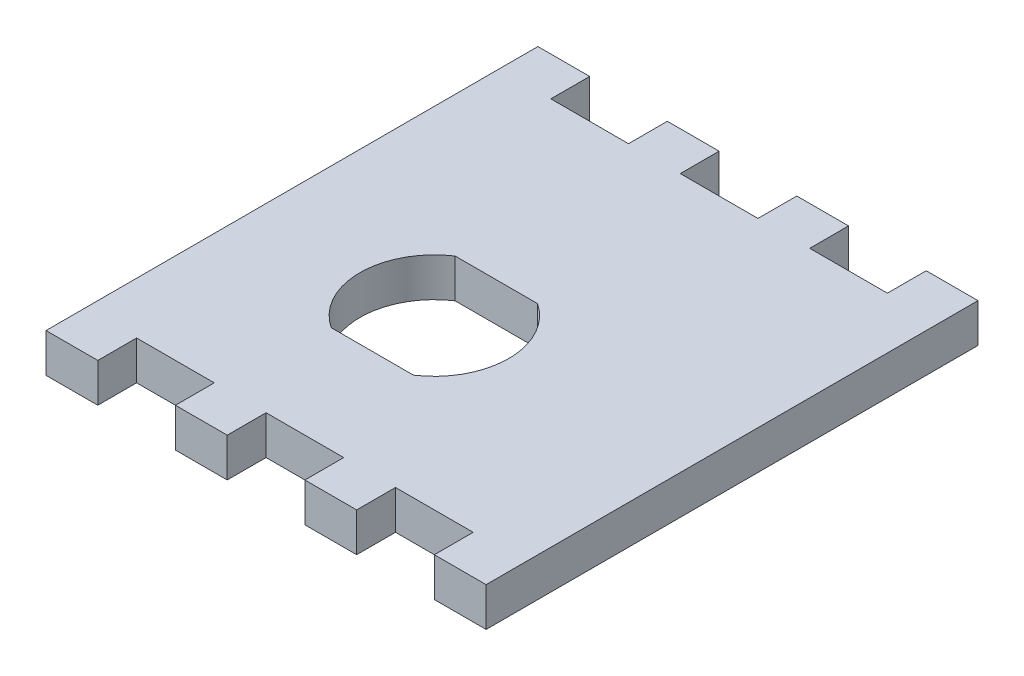
ISO-10303-21;
HEADER;
FILE_DESCRIPTION(('STEP AP214'),'2;1');
FILE_NAME('part.step','',(''),(''),'','','');
FILE_SCHEMA(('AUTOMOTIVE_DESIGN { 1 0 10303 214 1 1 1 1 }'));
ENDSEC;
DATA;
#1=APPLICATION_CONTEXT('core data for automotive mechanical design processes');
#2=APPLICATION_PROTOCOL_DEFINITION('international standard','automotive_design',2000,#1);
#3=PRODUCT_CONTEXT('',#1,'mechanical');
#4=PRODUCT('Part','Part','',(#3));
#5=PRODUCT_RELATED_PRODUCT_CATEGORY('part','',(#4));
#6=PRODUCT_DEFINITION_FORMATION('','',#4);
#7=PRODUCT_DEFINITION_CONTEXT('part definition',#1,'design');
#8=PRODUCT_DEFINITION('design','',#6,#7);
#9=PRODUCT_DEFINITION_SHAPE('','',#8);
#10=(LENGTH_UNIT() NAMED_UNIT(*) SI_UNIT(.MILLI.,.METRE.));
#11=(NAMED_UNIT(*) PLANE_ANGLE_UNIT() SI_UNIT($,.RADIAN.));
#12=(NAMED_UNIT(*) SI_UNIT($,.STERADIAN.) SOLID_ANGLE_UNIT());
#13=UNCERTAINTY_MEASURE_WITH_UNIT(LENGTH_MEASURE(1.E-05),#10,'distance_accuracy_value','');
#14=(GEOMETRIC_REPRESENTATION_CONTEXT(3) GLOBAL_UNCERTAINTY_ASSIGNED_CONTEXT((#13)) GLOBAL_UNIT_ASSIGNED_CONTEXT((#10,
#11,#12)) REPRESENTATION_CONTEXT('',''));
#15=CARTESIAN_POINT('',(0.,0.,0.));
#16=DIRECTION('',(0.,0.,1.));
#17=DIRECTION('',(1.,0.,0.));
#18=AXIS2_PLACEMENT_3D('',#15,#16,#17);
#19=CARTESIAN_POINT('',(-17.,3.,19.));
#20=DIRECTION('',(0.,0.,-1.));
#21=DIRECTION('',(-1.,0.,0.));
#22=AXIS2_PLACEMENT_3D('',#19,#20,#21);
#23=PLANE('',#22);
#24=DIRECTION('',(1.,0.,0.));
#25=VECTOR('',#24,1.);
#26=CARTESIAN_POINT('',(-17.,0.,19.));
#27=LINE('',#26,#25);
#28=CARTESIAN_POINT('',(3.,0.,19.));
#29=VERTEX_POINT('',#28);
#30=CARTESIAN_POINT('',(7.,0.,19.));
#31=VERTEX_POINT('',#30);
#32=EDGE_CURVE('E593',#29,#31,#27,.T.);
#33=ORIENTED_EDGE('',*,*,#32,.T.);
#34=DIRECTION('',(0.,1.,0.));
#35=VECTOR('',#34,1.);
#36=CARTESIAN_POINT('',(7.,0.,19.));
#37=LINE('',#36,#35);
#38=CARTESIAN_POINT('',(7.,3.,19.));
#39=VERTEX_POINT('',#38);
#40=EDGE_CURVE('E289',#31,#39,#37,.T.);
#41=ORIENTED_EDGE('',*,*,#40,.T.);
#42=DIRECTION('',(1.,0.,0.));
#43=VECTOR('',#42,1.);
#44=CARTESIAN_POINT('',(-17.,3.,19.));
#45=LINE('',#44,#43);
#46=CARTESIAN_POINT('',(3.,3.,19.));
#47=VERTEX_POINT('',#46);
#48=EDGE_CURVE('E606',#47,#39,#45,.T.);
#49=ORIENTED_EDGE('',*,*,#48,.F.);
#50=DIRECTION('',(0.,1.,0.));
#51=VECTOR('',#50,1.);
#52=CARTESIAN_POINT('',(3.,0.,19.));
#53=LINE('',#52,#51);
#54=EDGE_CURVE('E353',#29,#47,#53,.T.);
#55=ORIENTED_EDGE('',*,*,#54,.F.);
#56=EDGE_LOOP('',(#33,#41,#49,#55));
#57=FACE_BOUND('',#56,.T.);
#58=ADVANCED_FACE('F33',(#57),#23,.F.);
#59=CARTESIAN_POINT('',(-17.,3.,-19.));
#60=DIRECTION('',(0.,0.,1.));
#61=DIRECTION('',(1.,0.,0.));
#62=AXIS2_PLACEMENT_3D('',#59,#60,#61);
#63=PLANE('',#62);
#64=DIRECTION('',(-1.,0.,0.));
#65=VECTOR('',#64,1.);
#66=CARTESIAN_POINT('',(-17.,3.,-19.));
#67=LINE('',#66,#65);
#68=CARTESIAN_POINT('',(7.,3.,-19.));
#69=VERTEX_POINT('',#68);
#70=CARTESIAN_POINT('',(3.,3.,-19.));
#71=VERTEX_POINT('',#70);
#72=EDGE_CURVE('E446',#69,#71,#67,.T.);
#73=ORIENTED_EDGE('',*,*,#72,.F.);
#74=DIRECTION('',(0.,1.,0.));
#75=VECTOR('',#74,1.);
#76=CARTESIAN_POINT('',(7.,0.,-19.));
#77=LINE('',#76,#75);
#78=CARTESIAN_POINT('',(7.,0.,-19.));
#79=VERTEX_POINT('',#78);
#80=EDGE_CURVE('E322',#79,#69,#77,.T.);
#81=ORIENTED_EDGE('',*,*,#80,.F.);
#82=DIRECTION('',(-1.,0.,0.));
#83=VECTOR('',#82,1.);
#84=CARTESIAN_POINT('',(-17.,0.,-19.));
#85=LINE('',#84,#83);
#86=CARTESIAN_POINT('',(3.,0.,-19.));
#87=VERTEX_POINT('',#86);
#88=EDGE_CURVE('E461',#79,#87,#85,.T.);
#89=ORIENTED_EDGE('',*,*,#88,.T.);
#90=DIRECTION('',(0.,1.,0.));
#91=VECTOR('',#90,1.);
#92=CARTESIAN_POINT('',(3.,0.,-19.));
#93=LINE('',#92,#91);
#94=EDGE_CURVE('E378',#87,#71,#93,.T.);
#95=ORIENTED_EDGE('',*,*,#94,.T.);
#96=EDGE_LOOP('',(#73,#81,#89,#95));
#97=FACE_BOUND('',#96,.T.);
#98=ADVANCED_FACE('F509',(#97),#63,.F.);
#99=CARTESIAN_POINT('',(-7.,0.,19.));
#100=VERTEX_POINT('',#99);
#101=CARTESIAN_POINT('',(-3.,0.,19.));
#102=VERTEX_POINT('',#101);
#103=EDGE_CURVE('E466',#100,#102,#27,.T.);
#104=ORIENTED_EDGE('',*,*,#103,.T.);
#105=DIRECTION('',(0.,1.,0.));
#106=VECTOR('',#105,1.);
#107=CARTESIAN_POINT('',(-3.,0.,19.));
#108=LINE('',#107,#106);
#109=CARTESIAN_POINT('',(-3.,3.,19.));
#110=VERTEX_POINT('',#109);
#111=EDGE_CURVE('E341',#102,#110,#108,.T.);
#112=ORIENTED_EDGE('',*,*,#111,.T.);
#113=CARTESIAN_POINT('',(-7.,3.,19.));
#114=VERTEX_POINT('',#113);
#115=EDGE_CURVE('E453',#114,#110,#45,.T.);
#116=ORIENTED_EDGE('',*,*,#115,.F.);
#117=DIRECTION('',(0.,1.,0.));
#118=VECTOR('',#117,1.);
#119=CARTESIAN_POINT('',(-7.,0.,19.));
#120=LINE('',#119,#118);
#121=EDGE_CURVE('E406',#100,#114,#120,.T.);
#122=ORIENTED_EDGE('',*,*,#121,.F.);
#123=EDGE_LOOP('',(#104,#112,#116,#122));
#124=FACE_BOUND('',#123,.T.);
#125=ADVANCED_FACE('F546',(#124),#23,.F.);
#126=CARTESIAN_POINT('',(-3.,3.,-19.));
#127=VERTEX_POINT('',#126);
#128=CARTESIAN_POINT('',(-7.,3.,-19.));
#129=VERTEX_POINT('',#128);
#130=EDGE_CURVE('E494',#127,#129,#67,.T.);
#131=ORIENTED_EDGE('',*,*,#130,.F.);
#132=DIRECTION('',(0.,1.,0.));
#133=VECTOR('',#132,1.);
#134=CARTESIAN_POINT('',(-3.,0.,-19.));
#135=LINE('',#134,#133);
#136=CARTESIAN_POINT('',(-3.,0.,-19.));
#137=VERTEX_POINT('',#136);
#138=EDGE_CURVE('E375',#137,#127,#135,.T.);
#139=ORIENTED_EDGE('',*,*,#138,.F.);
#140=CARTESIAN_POINT('',(-7.,0.,-19.));
#141=VERTEX_POINT('',#140);
#142=EDGE_CURVE('E511',#137,#141,#85,.T.);
#143=ORIENTED_EDGE('',*,*,#142,.T.);
#144=DIRECTION('',(0.,1.,0.));
#145=VECTOR('',#144,1.);
#146=CARTESIAN_POINT('',(-7.,0.,-19.));
#147=LINE('',#146,#145);
#148=EDGE_CURVE('E431',#141,#129,#147,.T.);
#149=ORIENTED_EDGE('',*,*,#148,.T.);
#150=EDGE_LOOP('',(#131,#139,#143,#149));
#151=FACE_BOUND('',#150,.T.);
#152=ADVANCED_FACE('F525',(#151),#63,.F.);
#153=CARTESIAN_POINT('',(-17.,0.,19.));
#154=VERTEX_POINT('',#153);
#155=CARTESIAN_POINT('',(-13.,0.,19.));
#156=VERTEX_POINT('',#155);
#157=EDGE_CURVE('E441',#154,#156,#27,.T.);
#158=ORIENTED_EDGE('',*,*,#157,.T.);
#159=DIRECTION('',(0.,1.,0.));
#160=VECTOR('',#159,1.);
#161=CARTESIAN_POINT('',(-13.,0.,19.));
#162=LINE('',#161,#160);
#163=CARTESIAN_POINT('',(-13.,3.,19.));
#164=VERTEX_POINT('',#163);
#165=EDGE_CURVE('E394',#156,#164,#162,.T.);
#166=ORIENTED_EDGE('',*,*,#165,.T.);
#167=CARTESIAN_POINT('',(-17.,3.,19.));
#168=VERTEX_POINT('',#167);
#169=EDGE_CURVE('E449',#168,#164,#45,.T.);
#170=ORIENTED_EDGE('',*,*,#169,.F.);
#171=DIRECTION('',(0.,-1.,0.));
#172=VECTOR('',#171,1.);
#173=CARTESIAN_POINT('',(-17.,3.,19.));
#174=LINE('',#173,#172);
#175=EDGE_CURVE('E469',#168,#154,#174,.T.);
#176=ORIENTED_EDGE('',*,*,#175,.T.);
#177=EDGE_LOOP('',(#158,#166,#170,#176));
#178=FACE_BOUND('',#177,.T.);
#179=ADVANCED_FACE('F484',(#178),#23,.F.);
#180=CARTESIAN_POINT('',(-13.,3.,-19.));
#181=VERTEX_POINT('',#180);
#182=CARTESIAN_POINT('',(-17.,3.,-19.));
#183=VERTEX_POINT('',#182);
#184=EDGE_CURVE('E440',#181,#183,#67,.T.);
#185=ORIENTED_EDGE('',*,*,#184,.F.);
#186=DIRECTION('',(0.,1.,0.));
#187=VECTOR('',#186,1.);
#188=CARTESIAN_POINT('',(-13.,0.,-19.));
#189=LINE('',#188,#187);
#190=CARTESIAN_POINT('',(-13.,0.,-19.));
#191=VERTEX_POINT('',#190);
#192=EDGE_CURVE('E428',#191,#181,#189,.T.);
#193=ORIENTED_EDGE('',*,*,#192,.F.);
#194=CARTESIAN_POINT('',(-17.,0.,-19.));
#195=VERTEX_POINT('',#194);
#196=EDGE_CURVE('E456',#191,#195,#85,.T.);
#197=ORIENTED_EDGE('',*,*,#196,.T.);
#198=DIRECTION('',(0.,-1.,0.));
#199=VECTOR('',#198,1.);
#200=CARTESIAN_POINT('',(-17.,3.,-19.));
#201=LINE('',#200,#199);
#202=EDGE_CURVE('E41',#183,#195,#201,.T.);
#203=ORIENTED_EDGE('',*,*,#202,.F.);
#204=EDGE_LOOP('',(#185,#193,#197,#203));
#205=FACE_BOUND('',#204,.T.);
#206=ADVANCED_FACE('F516',(#205),#63,.F.);
#207=CARTESIAN_POINT('',(17.,3.,19.));
#208=DIRECTION('',(-1.,0.,0.));
#209=DIRECTION('',(0.,0.,1.));
#210=AXIS2_PLACEMENT_3D('',#207,#208,#209);
#211=PLANE('',#210);
#212=DIRECTION('',(0.,0.,-1.));
#213=VECTOR('',#212,1.);
#214=CARTESIAN_POINT('',(17.,0.,19.));
#215=LINE('',#214,#213);
#216=CARTESIAN_POINT('',(17.,0.,19.));
#217=VERTEX_POINT('',#216);
#218=CARTESIAN_POINT('',(17.,0.,-19.));
#219=VERTEX_POINT('',#218);
#220=EDGE_CURVE('E430',#217,#219,#215,.T.);
#221=ORIENTED_EDGE('',*,*,#220,.T.);
#222=DIRECTION('',(0.,-1.,0.));
#223=VECTOR('',#222,1.);
#224=CARTESIAN_POINT('',(17.,3.,-19.));
#225=LINE('',#224,#223);
#226=CARTESIAN_POINT('',(17.,3.,-19.));
#227=VERTEX_POINT('',#226);
#228=EDGE_CURVE('E11',#227,#219,#225,.T.);
#229=ORIENTED_EDGE('',*,*,#228,.F.);
#230=DIRECTION('',(0.,0.,-1.));
#231=VECTOR('',#230,1.);
#232=CARTESIAN_POINT('',(17.,3.,19.));
#233=LINE('',#232,#231);
#234=CARTESIAN_POINT('',(17.,3.,19.));
#235=VERTEX_POINT('',#234);
#236=EDGE_CURVE('E437',#235,#227,#233,.T.);
#237=ORIENTED_EDGE('',*,*,#236,.F.);
#238=DIRECTION('',(0.,-1.,0.));
#239=VECTOR('',#238,1.);
#240=CARTESIAN_POINT('',(17.,3.,19.));
#241=LINE('',#240,#239);
#242=EDGE_CURVE('E452',#235,#217,#241,.T.);
#243=ORIENTED_EDGE('',*,*,#242,.T.);
#244=EDGE_LOOP('',(#221,#229,#237,#243));
#245=FACE_BOUND('',#244,.T.);
#246=ADVANCED_FACE('F35',(#245),#211,.F.);
#247=CARTESIAN_POINT('',(13.,0.,-19.));
#248=VERTEX_POINT('',#247);
#249=EDGE_CURVE('E457',#219,#248,#85,.T.);
#250=ORIENTED_EDGE('',*,*,#249,.T.);
#251=DIRECTION('',(0.,1.,0.));
#252=VECTOR('',#251,1.);
#253=CARTESIAN_POINT('',(13.,0.,-19.));
#254=LINE('',#253,#252);
#255=CARTESIAN_POINT('',(13.,3.,-19.));
#256=VERTEX_POINT('',#255);
#257=EDGE_CURVE('E325',#248,#256,#254,.T.);
#258=ORIENTED_EDGE('',*,*,#257,.T.);
#259=EDGE_CURVE('E442',#227,#256,#67,.T.);
#260=ORIENTED_EDGE('',*,*,#259,.F.);
#261=ORIENTED_EDGE('',*,*,#228,.T.);
#262=EDGE_LOOP('',(#250,#258,#260,#261));
#263=FACE_BOUND('',#262,.T.);
#264=ADVANCED_FACE('F551',(#263),#63,.F.);
#265=CARTESIAN_POINT('',(-17.,3.,19.));
#266=DIRECTION('',(1.,0.,0.));
#267=DIRECTION('',(0.,0.,-1.));
#268=AXIS2_PLACEMENT_3D('',#265,#266,#267);
#269=PLANE('',#268);
#270=DIRECTION('',(0.,0.,1.));
#271=VECTOR('',#270,1.);
#272=CARTESIAN_POINT('',(-17.,0.,19.));
#273=LINE('',#272,#271);
#274=EDGE_CURVE('E460',#195,#154,#273,.T.);
#275=ORIENTED_EDGE('',*,*,#274,.T.);
#276=ORIENTED_EDGE('',*,*,#175,.F.);
#277=DIRECTION('',(0.,0.,1.));
#278=VECTOR('',#277,1.);
#279=CARTESIAN_POINT('',(-17.,3.,19.));
#280=LINE('',#279,#278);
#281=EDGE_CURVE('E445',#183,#168,#280,.T.);
#282=ORIENTED_EDGE('',*,*,#281,.F.);
#283=ORIENTED_EDGE('',*,*,#202,.T.);
#284=EDGE_LOOP('',(#275,#276,#282,#283));
#285=FACE_BOUND('',#284,.T.);
#286=ADVANCED_FACE('F476',(#285),#269,.F.);
#287=CARTESIAN_POINT('',(13.,3.,19.));
#288=VERTEX_POINT('',#287);
#289=EDGE_CURVE('E448',#288,#235,#45,.T.);
#290=ORIENTED_EDGE('',*,*,#289,.F.);
#291=DIRECTION('',(0.,1.,0.));
#292=VECTOR('',#291,1.);
#293=CARTESIAN_POINT('',(13.,0.,19.));
#294=LINE('',#293,#292);
#295=CARTESIAN_POINT('',(13.,0.,19.));
#296=VERTEX_POINT('',#295);
#297=EDGE_CURVE('E301',#296,#288,#294,.T.);
#298=ORIENTED_EDGE('',*,*,#297,.F.);
#299=EDGE_CURVE('E463',#296,#217,#27,.T.);
#300=ORIENTED_EDGE('',*,*,#299,.T.);
#301=ORIENTED_EDGE('',*,*,#242,.F.);
#302=EDGE_LOOP('',(#290,#298,#300,#301));
#303=FACE_BOUND('',#302,.T.);
#304=ADVANCED_FACE('F547',(#303),#23,.F.);
#305=CARTESIAN_POINT('',(0.,3.,0.));
#306=DIRECTION('',(0.,-1.,0.));
#307=DIRECTION('',(0.,0.,-1.));
#308=AXIS2_PLACEMENT_3D('',#305,#306,#307);
#309=PLANE('',#308);
#310=DIRECTION('',(-1.,0.,0.));
#311=VECTOR('',#310,1.);
#312=CARTESIAN_POINT('',(-6.18332409593905,3.,-1.78841807909604));
#313=LINE('',#312,#311);
#314=CARTESIAN_POINT('',(0.18332409593905,3.,-1.78841807909604));
#315=VERTEX_POINT('',#314);
#316=CARTESIAN_POINT('',(-6.18332409593905,3.,-1.78841807909604));
#317=VERTEX_POINT('',#316);
#318=EDGE_CURVE('E269',#315,#317,#313,.T.);
#319=ORIENTED_EDGE('',*,*,#318,.F.);
#320=CARTESIAN_POINT('',(-3.,3.,3.));
#321=DIRECTION('',(0.,1.,0.));
#322=DIRECTION('',(0.,0.,1.));
#323=AXIS2_PLACEMENT_3D('',#320,#321,#322);
#324=CIRCLE('',#323,5.75);
#325=CARTESIAN_POINT('',(0.178432090757255,3.,7.79166666666667));
#326=VERTEX_POINT('',#325);
#327=EDGE_CURVE('E48',#326,#315,#324,.T.);
#328=ORIENTED_EDGE('',*,*,#327,.F.);
#329=DIRECTION('',(1.,0.,0.));
#330=VECTOR('',#329,1.);
#331=CARTESIAN_POINT('',(-6.17843209075726,3.,7.79166666666667));
#332=LINE('',#331,#330);
#333=CARTESIAN_POINT('',(-6.17843209075726,3.,7.79166666666667));
#334=VERTEX_POINT('',#333);
#335=EDGE_CURVE('E260',#334,#326,#332,.T.);
#336=ORIENTED_EDGE('',*,*,#335,.F.);
#337=CARTESIAN_POINT('',(-3.,3.,3.));
#338=DIRECTION('',(0.,1.,0.));
#339=DIRECTION('',(0.,0.,1.));
#340=AXIS2_PLACEMENT_3D('',#337,#338,#339);
#341=CIRCLE('',#340,5.75);
#342=EDGE_CURVE('E263',#317,#334,#341,.T.);
#343=ORIENTED_EDGE('',*,*,#342,.F.);
#344=EDGE_LOOP('',(#319,#328,#336,#343));
#345=FACE_BOUND('',#344,.T.);
#346=ORIENTED_EDGE('',*,*,#48,.T.);
#347=DIRECTION('',(0.,0.,1.));
#348=VECTOR('',#347,1.);
#349=CARTESIAN_POINT('',(7.,3.,16.));
#350=LINE('',#349,#348);
#351=CARTESIAN_POINT('',(7.,3.,16.));
#352=VERTEX_POINT('',#351);
#353=EDGE_CURVE('E275',#352,#39,#350,.T.);
#354=ORIENTED_EDGE('',*,*,#353,.F.);
#355=DIRECTION('',(-1.,0.,0.));
#356=VECTOR('',#355,1.);
#357=CARTESIAN_POINT('',(7.,3.,16.));
#358=LINE('',#357,#356);
#359=CARTESIAN_POINT('',(13.,3.,16.));
#360=VERTEX_POINT('',#359);
#361=EDGE_CURVE('E283',#360,#352,#358,.T.);
#362=ORIENTED_EDGE('',*,*,#361,.F.);
#363=DIRECTION('',(0.,0.,-1.));
#364=VECTOR('',#363,1.);
#365=CARTESIAN_POINT('',(13.,3.,16.));
#366=LINE('',#365,#364);
#367=EDGE_CURVE('E291',#288,#360,#366,.T.);
#368=ORIENTED_EDGE('',*,*,#367,.F.);
#369=ORIENTED_EDGE('',*,*,#289,.T.);
#370=ORIENTED_EDGE('',*,*,#236,.T.);
#371=ORIENTED_EDGE('',*,*,#259,.T.);
#372=DIRECTION('',(0.,0.,-1.));
#373=VECTOR('',#372,1.);
#374=CARTESIAN_POINT('',(13.,3.,-19.));
#375=LINE('',#374,#373);
#376=CARTESIAN_POINT('',(13.,3.,-16.));
#377=VERTEX_POINT('',#376);
#378=EDGE_CURVE('E309',#377,#256,#375,.T.);
#379=ORIENTED_EDGE('',*,*,#378,.F.);
#380=DIRECTION('',(1.,0.,0.));
#381=VECTOR('',#380,1.);
#382=CARTESIAN_POINT('',(7.,3.,-16.));
#383=LINE('',#382,#381);
#384=CARTESIAN_POINT('',(7.,3.,-16.));
#385=VERTEX_POINT('',#384);
#386=EDGE_CURVE('E318',#385,#377,#383,.T.);
#387=ORIENTED_EDGE('',*,*,#386,.F.);
#388=DIRECTION('',(0.,0.,1.));
#389=VECTOR('',#388,1.);
#390=CARTESIAN_POINT('',(7.,3.,-19.));
#391=LINE('',#390,#389);
#392=EDGE_CURVE('E298',#69,#385,#391,.T.);
#393=ORIENTED_EDGE('',*,*,#392,.F.);
#394=ORIENTED_EDGE('',*,*,#72,.T.);
#395=DIRECTION('',(0.,0.,-1.));
#396=VECTOR('',#395,1.);
#397=CARTESIAN_POINT('',(3.,3.,-19.));
#398=LINE('',#397,#396);
#399=CARTESIAN_POINT('',(3.,3.,-16.));
#400=VERTEX_POINT('',#399);
#401=EDGE_CURVE('E361',#400,#71,#398,.T.);
#402=ORIENTED_EDGE('',*,*,#401,.F.);
#403=DIRECTION('',(1.,0.,0.));
#404=VECTOR('',#403,1.);
#405=CARTESIAN_POINT('',(-3.,3.,-16.));
#406=LINE('',#405,#404);
#407=CARTESIAN_POINT('',(-3.,3.,-16.));
#408=VERTEX_POINT('',#407);
#409=EDGE_CURVE('E370',#408,#400,#406,.T.);
#410=ORIENTED_EDGE('',*,*,#409,.F.);
#411=DIRECTION('',(0.,0.,1.));
#412=VECTOR('',#411,1.);
#413=CARTESIAN_POINT('',(-3.,3.,-19.));
#414=LINE('',#413,#412);
#415=EDGE_CURVE('E350',#127,#408,#414,.T.);
#416=ORIENTED_EDGE('',*,*,#415,.F.);
#417=ORIENTED_EDGE('',*,*,#130,.T.);
#418=DIRECTION('',(0.,0.,-1.));
#419=VECTOR('',#418,1.);
#420=CARTESIAN_POINT('',(-7.,3.,-19.));
#421=LINE('',#420,#419);
#422=CARTESIAN_POINT('',(-7.,3.,-16.));
#423=VERTEX_POINT('',#422);
#424=EDGE_CURVE('E414',#423,#129,#421,.T.);
#425=ORIENTED_EDGE('',*,*,#424,.F.);
#426=DIRECTION('',(1.,0.,0.));
#427=VECTOR('',#426,1.);
#428=CARTESIAN_POINT('',(-13.,3.,-16.));
#429=LINE('',#428,#427);
#430=CARTESIAN_POINT('',(-13.,3.,-16.));
#431=VERTEX_POINT('',#430);
#432=EDGE_CURVE('E423',#431,#423,#429,.T.);
#433=ORIENTED_EDGE('',*,*,#432,.F.);
#434=DIRECTION('',(0.,0.,1.));
#435=VECTOR('',#434,1.);
#436=CARTESIAN_POINT('',(-13.,3.,-19.));
#437=LINE('',#436,#435);
#438=EDGE_CURVE('E403',#181,#431,#437,.T.);
#439=ORIENTED_EDGE('',*,*,#438,.F.);
#440=ORIENTED_EDGE('',*,*,#184,.T.);
#441=ORIENTED_EDGE('',*,*,#281,.T.);
#442=ORIENTED_EDGE('',*,*,#169,.T.);
#443=DIRECTION('',(0.,0.,1.));
#444=VECTOR('',#443,1.);
#445=CARTESIAN_POINT('',(-13.,3.,16.));
#446=LINE('',#445,#444);
#447=CARTESIAN_POINT('',(-13.,3.,16.));
#448=VERTEX_POINT('',#447);
#449=EDGE_CURVE('E377',#448,#164,#446,.T.);
#450=ORIENTED_EDGE('',*,*,#449,.F.);
#451=DIRECTION('',(-1.,0.,0.));
#452=VECTOR('',#451,1.);
#453=CARTESIAN_POINT('',(-13.,3.,16.));
#454=LINE('',#453,#452);
#455=CARTESIAN_POINT('',(-7.,3.,16.));
#456=VERTEX_POINT('',#455);
#457=EDGE_CURVE('E388',#456,#448,#454,.T.);
#458=ORIENTED_EDGE('',*,*,#457,.F.);
#459=DIRECTION('',(0.,0.,-1.));
#460=VECTOR('',#459,1.);
#461=CARTESIAN_POINT('',(-7.,3.,16.));
#462=LINE('',#461,#460);
#463=EDGE_CURVE('E396',#114,#456,#462,.T.);
#464=ORIENTED_EDGE('',*,*,#463,.F.);
#465=ORIENTED_EDGE('',*,*,#115,.T.);
#466=DIRECTION('',(0.,0.,1.));
#467=VECTOR('',#466,1.);
#468=CARTESIAN_POINT('',(-3.,3.,16.));
#469=LINE('',#468,#467);
#470=CARTESIAN_POINT('',(-3.,3.,16.));
#471=VERTEX_POINT('',#470);
#472=EDGE_CURVE('E324',#471,#110,#469,.T.);
#473=ORIENTED_EDGE('',*,*,#472,.F.);
#474=DIRECTION('',(-1.,0.,0.));
#475=VECTOR('',#474,1.);
#476=CARTESIAN_POINT('',(-3.,3.,16.));
#477=LINE('',#476,#475);
#478=CARTESIAN_POINT('',(3.,3.,16.));
#479=VERTEX_POINT('',#478);
#480=EDGE_CURVE('E335',#479,#471,#477,.T.);
#481=ORIENTED_EDGE('',*,*,#480,.F.);
#482=DIRECTION('',(0.,0.,-1.));
#483=VECTOR('',#482,1.);
#484=CARTESIAN_POINT('',(3.,3.,16.));
#485=LINE('',#484,#483);
#486=EDGE_CURVE('E343',#47,#479,#485,.T.);
#487=ORIENTED_EDGE('',*,*,#486,.F.);
#488=EDGE_LOOP('',(#346,#354,#362,#368,#369,#370,#371,#379,#387,#393,#394,#402,#410,#416,#417,
#425,#433,#439,#440,#441,#442,#450,#458,#464,#465,#473,#481,#487));
#489=FACE_BOUND('',#488,.T.);
#490=ADVANCED_FACE('F489',(#345,#489),#309,.F.);
#491=CARTESIAN_POINT('',(0.,0.,0.));
#492=DIRECTION('',(0.,-1.,0.));
#493=DIRECTION('',(0.,0.,-1.));
#494=AXIS2_PLACEMENT_3D('',#491,#492,#493);
#495=PLANE('',#494);
#496=CARTESIAN_POINT('',(-3.,0.,3.));
#497=DIRECTION('',(0.,1.,0.));
#498=DIRECTION('',(0.,0.,1.));
#499=AXIS2_PLACEMENT_3D('',#496,#497,#498);
#500=CIRCLE('',#499,5.75);
#501=CARTESIAN_POINT('',(0.178432090757255,0.,7.79166666666667));
#502=VERTEX_POINT('',#501);
#503=CARTESIAN_POINT('',(0.18332409593905,0.,-1.78841807909604));
#504=VERTEX_POINT('',#503);
#505=EDGE_CURVE('E244',#502,#504,#500,.T.);
#506=ORIENTED_EDGE('',*,*,#505,.T.);
#507=DIRECTION('',(-1.,0.,0.));
#508=VECTOR('',#507,1.);
#509=CARTESIAN_POINT('',(-6.18332409593905,0.,-1.78841807909604));
#510=LINE('',#509,#508);
#511=CARTESIAN_POINT('',(-6.18332409593905,0.,-1.78841807909604));
#512=VERTEX_POINT('',#511);
#513=EDGE_CURVE('E253',#504,#512,#510,.T.);
#514=ORIENTED_EDGE('',*,*,#513,.T.);
#515=CARTESIAN_POINT('',(-3.,0.,3.));
#516=DIRECTION('',(0.,1.,0.));
#517=DIRECTION('',(0.,0.,1.));
#518=AXIS2_PLACEMENT_3D('',#515,#516,#517);
#519=CIRCLE('',#518,5.75);
#520=CARTESIAN_POINT('',(-6.17843209075726,0.,7.79166666666667));
#521=VERTEX_POINT('',#520);
#522=EDGE_CURVE('E56',#512,#521,#519,.T.);
#523=ORIENTED_EDGE('',*,*,#522,.T.);
#524=DIRECTION('',(1.,0.,0.));
#525=VECTOR('',#524,1.);
#526=CARTESIAN_POINT('',(-6.17843209075726,0.,7.79166666666667));
#527=LINE('',#526,#525);
#528=EDGE_CURVE('E250',#521,#502,#527,.T.);
#529=ORIENTED_EDGE('',*,*,#528,.T.);
#530=EDGE_LOOP('',(#506,#514,#523,#529));
#531=FACE_BOUND('',#530,.T.);
#532=DIRECTION('',(0.,0.,1.));
#533=VECTOR('',#532,1.);
#534=CARTESIAN_POINT('',(7.,0.,16.));
#535=LINE('',#534,#533);
#536=CARTESIAN_POINT('',(7.,0.,16.));
#537=VERTEX_POINT('',#536);
#538=EDGE_CURVE('E279',#537,#31,#535,.T.);
#539=ORIENTED_EDGE('',*,*,#538,.T.);
#540=ORIENTED_EDGE('',*,*,#32,.F.);
#541=DIRECTION('',(0.,0.,-1.));
#542=VECTOR('',#541,1.);
#543=CARTESIAN_POINT('',(3.,0.,16.));
#544=LINE('',#543,#542);
#545=CARTESIAN_POINT('',(3.,0.,16.));
#546=VERTEX_POINT('',#545);
#547=EDGE_CURVE('E334',#29,#546,#544,.T.);
#548=ORIENTED_EDGE('',*,*,#547,.T.);
#549=DIRECTION('',(-1.,0.,0.));
#550=VECTOR('',#549,1.);
#551=CARTESIAN_POINT('',(-3.,0.,16.));
#552=LINE('',#551,#550);
#553=CARTESIAN_POINT('',(-3.,0.,16.));
#554=VERTEX_POINT('',#553);
#555=EDGE_CURVE('E338',#546,#554,#552,.T.);
#556=ORIENTED_EDGE('',*,*,#555,.T.);
#557=DIRECTION('',(0.,0.,1.));
#558=VECTOR('',#557,1.);
#559=CARTESIAN_POINT('',(-3.,0.,16.));
#560=LINE('',#559,#558);
#561=EDGE_CURVE('E331',#554,#102,#560,.T.);
#562=ORIENTED_EDGE('',*,*,#561,.T.);
#563=ORIENTED_EDGE('',*,*,#103,.F.);
#564=DIRECTION('',(0.,0.,-1.));
#565=VECTOR('',#564,1.);
#566=CARTESIAN_POINT('',(-7.,0.,16.));
#567=LINE('',#566,#565);
#568=CARTESIAN_POINT('',(-7.,0.,16.));
#569=VERTEX_POINT('',#568);
#570=EDGE_CURVE('E387',#100,#569,#567,.T.);
#571=ORIENTED_EDGE('',*,*,#570,.T.);
#572=DIRECTION('',(-1.,0.,0.));
#573=VECTOR('',#572,1.);
#574=CARTESIAN_POINT('',(-13.,0.,16.));
#575=LINE('',#574,#573);
#576=CARTESIAN_POINT('',(-13.,0.,16.));
#577=VERTEX_POINT('',#576);
#578=EDGE_CURVE('E391',#569,#577,#575,.T.);
#579=ORIENTED_EDGE('',*,*,#578,.T.);
#580=DIRECTION('',(0.,0.,1.));
#581=VECTOR('',#580,1.);
#582=CARTESIAN_POINT('',(-13.,0.,16.));
#583=LINE('',#582,#581);
#584=EDGE_CURVE('E384',#577,#156,#583,.T.);
#585=ORIENTED_EDGE('',*,*,#584,.T.);
#586=ORIENTED_EDGE('',*,*,#157,.F.);
#587=ORIENTED_EDGE('',*,*,#274,.F.);
#588=ORIENTED_EDGE('',*,*,#196,.F.);
#589=DIRECTION('',(0.,0.,1.));
#590=VECTOR('',#589,1.);
#591=CARTESIAN_POINT('',(-13.,0.,-19.));
#592=LINE('',#591,#590);
#593=CARTESIAN_POINT('',(-13.,0.,-16.));
#594=VERTEX_POINT('',#593);
#595=EDGE_CURVE('E410',#191,#594,#592,.T.);
#596=ORIENTED_EDGE('',*,*,#595,.T.);
#597=DIRECTION('',(1.,0.,0.));
#598=VECTOR('',#597,1.);
#599=CARTESIAN_POINT('',(-13.,0.,-16.));
#600=LINE('',#599,#598);
#601=CARTESIAN_POINT('',(-7.,0.,-16.));
#602=VERTEX_POINT('',#601);
#603=EDGE_CURVE('E413',#594,#602,#600,.T.);
#604=ORIENTED_EDGE('',*,*,#603,.T.);
#605=DIRECTION('',(0.,0.,-1.));
#606=VECTOR('',#605,1.);
#607=CARTESIAN_POINT('',(-7.,0.,-19.));
#608=LINE('',#607,#606);
#609=EDGE_CURVE('E417',#602,#141,#608,.T.);
#610=ORIENTED_EDGE('',*,*,#609,.T.);
#611=ORIENTED_EDGE('',*,*,#142,.F.);
#612=DIRECTION('',(0.,0.,1.));
#613=VECTOR('',#612,1.);
#614=CARTESIAN_POINT('',(-3.,0.,-19.));
#615=LINE('',#614,#613);
#616=CARTESIAN_POINT('',(-3.,0.,-16.));
#617=VERTEX_POINT('',#616);
#618=EDGE_CURVE('E357',#137,#617,#615,.T.);
#619=ORIENTED_EDGE('',*,*,#618,.T.);
#620=DIRECTION('',(1.,0.,0.));
#621=VECTOR('',#620,1.);
#622=CARTESIAN_POINT('',(-3.,0.,-16.));
#623=LINE('',#622,#621);
#624=CARTESIAN_POINT('',(3.,0.,-16.));
#625=VERTEX_POINT('',#624);
#626=EDGE_CURVE('E360',#617,#625,#623,.T.);
#627=ORIENTED_EDGE('',*,*,#626,.T.);
#628=DIRECTION('',(0.,0.,-1.));
#629=VECTOR('',#628,1.);
#630=CARTESIAN_POINT('',(3.,0.,-19.));
#631=LINE('',#630,#629);
#632=EDGE_CURVE('E364',#625,#87,#631,.T.);
#633=ORIENTED_EDGE('',*,*,#632,.T.);
#634=ORIENTED_EDGE('',*,*,#88,.F.);
#635=DIRECTION('',(0.,0.,1.));
#636=VECTOR('',#635,1.);
#637=CARTESIAN_POINT('',(7.,0.,-19.));
#638=LINE('',#637,#636);
#639=CARTESIAN_POINT('',(7.,0.,-16.));
#640=VERTEX_POINT('',#639);
#641=EDGE_CURVE('E305',#79,#640,#638,.T.);
#642=ORIENTED_EDGE('',*,*,#641,.T.);
#643=DIRECTION('',(1.,0.,0.));
#644=VECTOR('',#643,1.);
#645=CARTESIAN_POINT('',(7.,0.,-16.));
#646=LINE('',#645,#644);
#647=CARTESIAN_POINT('',(13.,0.,-16.));
#648=VERTEX_POINT('',#647);
#649=EDGE_CURVE('E308',#640,#648,#646,.T.);
#650=ORIENTED_EDGE('',*,*,#649,.T.);
#651=DIRECTION('',(0.,0.,-1.));
#652=VECTOR('',#651,1.);
#653=CARTESIAN_POINT('',(13.,0.,-19.));
#654=LINE('',#653,#652);
#655=EDGE_CURVE('E312',#648,#248,#654,.T.);
#656=ORIENTED_EDGE('',*,*,#655,.T.);
#657=ORIENTED_EDGE('',*,*,#249,.F.);
#658=ORIENTED_EDGE('',*,*,#220,.F.);
#659=ORIENTED_EDGE('',*,*,#299,.F.);
#660=DIRECTION('',(0.,0.,-1.));
#661=VECTOR('',#660,1.);
#662=CARTESIAN_POINT('',(13.,0.,16.));
#663=LINE('',#662,#661);
#664=CARTESIAN_POINT('',(13.,0.,16.));
#665=VERTEX_POINT('',#664);
#666=EDGE_CURVE('E282',#296,#665,#663,.T.);
#667=ORIENTED_EDGE('',*,*,#666,.T.);
#668=DIRECTION('',(-1.,0.,0.));
#669=VECTOR('',#668,1.);
#670=CARTESIAN_POINT('',(7.,0.,16.));
#671=LINE('',#670,#669);
#672=EDGE_CURVE('E286',#665,#537,#671,.T.);
#673=ORIENTED_EDGE('',*,*,#672,.T.);
#674=EDGE_LOOP('',(#539,#540,#548,#556,#562,#563,#571,#579,#585,#586,#587,#588,#596,#604,#610,
#611,#619,#627,#633,#634,#642,#650,#656,#657,#658,#659,#667,#673));
#675=FACE_BOUND('',#674,.T.);
#676=ADVANCED_FACE('F257',(#531,#675),#495,.T.);
#677=CARTESIAN_POINT('',(-13.,0.,-19.));
#678=DIRECTION('',(-1.,0.,0.));
#679=DIRECTION('',(0.,0.,1.));
#680=AXIS2_PLACEMENT_3D('',#677,#678,#679);
#681=PLANE('',#680);
#682=ORIENTED_EDGE('',*,*,#438,.T.);
#683=DIRECTION('',(0.,1.,0.));
#684=VECTOR('',#683,1.);
#685=CARTESIAN_POINT('',(-13.,0.,-16.));
#686=LINE('',#685,#684);
#687=EDGE_CURVE('E420',#594,#431,#686,.T.);
#688=ORIENTED_EDGE('',*,*,#687,.F.);
#689=ORIENTED_EDGE('',*,*,#595,.F.);
#690=ORIENTED_EDGE('',*,*,#192,.T.);
#691=EDGE_LOOP('',(#682,#688,#689,#690));
#692=FACE_BOUND('',#691,.T.);
#693=ADVANCED_FACE('F518',(#692),#681,.F.);
#694=CARTESIAN_POINT('',(-7.,0.,-19.));
#695=DIRECTION('',(1.,0.,0.));
#696=DIRECTION('',(0.,0.,-1.));
#697=AXIS2_PLACEMENT_3D('',#694,#695,#696);
#698=PLANE('',#697);
#699=ORIENTED_EDGE('',*,*,#424,.T.);
#700=ORIENTED_EDGE('',*,*,#148,.F.);
#701=ORIENTED_EDGE('',*,*,#609,.F.);
#702=DIRECTION('',(0.,1.,0.));
#703=VECTOR('',#702,1.);
#704=CARTESIAN_POINT('',(-7.,0.,-16.));
#705=LINE('',#704,#703);
#706=EDGE_CURVE('E434',#602,#423,#705,.T.);
#707=ORIENTED_EDGE('',*,*,#706,.T.);
#708=EDGE_LOOP('',(#699,#700,#701,#707));
#709=FACE_BOUND('',#708,.T.);
#710=ADVANCED_FACE('F524',(#709),#698,.F.);
#711=CARTESIAN_POINT('',(-13.,0.,-16.));
#712=DIRECTION('',(0.,0.,1.));
#713=DIRECTION('',(1.,0.,0.));
#714=AXIS2_PLACEMENT_3D('',#711,#712,#713);
#715=PLANE('',#714);
#716=ORIENTED_EDGE('',*,*,#432,.T.);
#717=ORIENTED_EDGE('',*,*,#706,.F.);
#718=ORIENTED_EDGE('',*,*,#603,.F.);
#719=ORIENTED_EDGE('',*,*,#687,.T.);
#720=EDGE_LOOP('',(#716,#717,#718,#719));
#721=FACE_BOUND('',#720,.T.);
#722=ADVANCED_FACE('F522',(#721),#715,.F.);
#723=CARTESIAN_POINT('',(-13.,0.,16.));
#724=DIRECTION('',(-1.,0.,0.));
#725=DIRECTION('',(0.,0.,1.));
#726=AXIS2_PLACEMENT_3D('',#723,#724,#725);
#727=PLANE('',#726);
#728=ORIENTED_EDGE('',*,*,#449,.T.);
#729=ORIENTED_EDGE('',*,*,#165,.F.);
#730=ORIENTED_EDGE('',*,*,#584,.F.);
#731=DIRECTION('',(0.,1.,0.));
#732=VECTOR('',#731,1.);
#733=CARTESIAN_POINT('',(-13.,0.,16.));
#734=LINE('',#733,#732);
#735=EDGE_CURVE('E401',#577,#448,#734,.T.);
#736=ORIENTED_EDGE('',*,*,#735,.T.);
#737=EDGE_LOOP('',(#728,#729,#730,#736));
#738=FACE_BOUND('',#737,.T.);
#739=ADVANCED_FACE('F743',(#738),#727,.F.);
#740=CARTESIAN_POINT('',(-13.,0.,16.));
#741=DIRECTION('',(0.,0.,-1.));
#742=DIRECTION('',(-1.,0.,0.));
#743=AXIS2_PLACEMENT_3D('',#740,#741,#742);
#744=PLANE('',#743);
#745=ORIENTED_EDGE('',*,*,#457,.T.);
#746=ORIENTED_EDGE('',*,*,#735,.F.);
#747=ORIENTED_EDGE('',*,*,#578,.F.);
#748=DIRECTION('',(0.,1.,0.));
#749=VECTOR('',#748,1.);
#750=CARTESIAN_POINT('',(-7.,0.,16.));
#751=LINE('',#750,#749);
#752=EDGE_CURVE('E404',#569,#456,#751,.T.);
#753=ORIENTED_EDGE('',*,*,#752,.T.);
#754=EDGE_LOOP('',(#745,#746,#747,#753));
#755=FACE_BOUND('',#754,.T.);
#756=ADVANCED_FACE('F750',(#755),#744,.F.);
#757=CARTESIAN_POINT('',(-7.,0.,16.));
#758=DIRECTION('',(1.,0.,0.));
#759=DIRECTION('',(0.,0.,-1.));
#760=AXIS2_PLACEMENT_3D('',#757,#758,#759);
#761=PLANE('',#760);
#762=ORIENTED_EDGE('',*,*,#463,.T.);
#763=ORIENTED_EDGE('',*,*,#752,.F.);
#764=ORIENTED_EDGE('',*,*,#570,.F.);
#765=ORIENTED_EDGE('',*,*,#121,.T.);
#766=EDGE_LOOP('',(#762,#763,#764,#765));
#767=FACE_BOUND('',#766,.T.);
#768=ADVANCED_FACE('F758',(#767),#761,.F.);
#769=CARTESIAN_POINT('',(-3.,0.,-19.));
#770=DIRECTION('',(-1.,0.,0.));
#771=DIRECTION('',(0.,0.,1.));
#772=AXIS2_PLACEMENT_3D('',#769,#770,#771);
#773=PLANE('',#772);
#774=ORIENTED_EDGE('',*,*,#415,.T.);
#775=DIRECTION('',(0.,1.,0.));
#776=VECTOR('',#775,1.);
#777=CARTESIAN_POINT('',(-3.,0.,-16.));
#778=LINE('',#777,#776);
#779=EDGE_CURVE('E367',#617,#408,#778,.T.);
#780=ORIENTED_EDGE('',*,*,#779,.F.);
#781=ORIENTED_EDGE('',*,*,#618,.F.);
#782=ORIENTED_EDGE('',*,*,#138,.T.);
#783=EDGE_LOOP('',(#774,#780,#781,#782));
#784=FACE_BOUND('',#783,.T.);
#785=ADVANCED_FACE('F528',(#784),#773,.F.);
#786=CARTESIAN_POINT('',(3.,0.,-19.));
#787=DIRECTION('',(1.,0.,0.));
#788=DIRECTION('',(0.,0.,-1.));
#789=AXIS2_PLACEMENT_3D('',#786,#787,#788);
#790=PLANE('',#789);
#791=ORIENTED_EDGE('',*,*,#401,.T.);
#792=ORIENTED_EDGE('',*,*,#94,.F.);
#793=ORIENTED_EDGE('',*,*,#632,.F.);
#794=DIRECTION('',(0.,1.,0.));
#795=VECTOR('',#794,1.);
#796=CARTESIAN_POINT('',(3.,0.,-16.));
#797=LINE('',#796,#795);
#798=EDGE_CURVE('E381',#625,#400,#797,.T.);
#799=ORIENTED_EDGE('',*,*,#798,.T.);
#800=EDGE_LOOP('',(#791,#792,#793,#799));
#801=FACE_BOUND('',#800,.T.);
#802=ADVANCED_FACE('F507',(#801),#790,.F.);
#803=CARTESIAN_POINT('',(-3.,0.,-16.));
#804=DIRECTION('',(0.,0.,1.));
#805=DIRECTION('',(1.,0.,0.));
#806=AXIS2_PLACEMENT_3D('',#803,#804,#805);
#807=PLANE('',#806);
#808=ORIENTED_EDGE('',*,*,#409,.T.);
#809=ORIENTED_EDGE('',*,*,#798,.F.);
#810=ORIENTED_EDGE('',*,*,#626,.F.);
#811=ORIENTED_EDGE('',*,*,#779,.T.);
#812=EDGE_LOOP('',(#808,#809,#810,#811));
#813=FACE_BOUND('',#812,.T.);
#814=ADVANCED_FACE('F530',(#813),#807,.F.);
#815=CARTESIAN_POINT('',(-3.,0.,16.));
#816=DIRECTION('',(-1.,0.,0.));
#817=DIRECTION('',(0.,0.,1.));
#818=AXIS2_PLACEMENT_3D('',#815,#816,#817);
#819=PLANE('',#818);
#820=ORIENTED_EDGE('',*,*,#472,.T.);
#821=ORIENTED_EDGE('',*,*,#111,.F.);
#822=ORIENTED_EDGE('',*,*,#561,.F.);
#823=DIRECTION('',(0.,1.,0.));
#824=VECTOR('',#823,1.);
#825=CARTESIAN_POINT('',(-3.,0.,16.));
#826=LINE('',#825,#824);
#827=EDGE_CURVE('E348',#554,#471,#826,.T.);
#828=ORIENTED_EDGE('',*,*,#827,.T.);
#829=EDGE_LOOP('',(#820,#821,#822,#828));
#830=FACE_BOUND('',#829,.T.);
#831=ADVANCED_FACE('F532',(#830),#819,.F.);
#832=CARTESIAN_POINT('',(-3.,0.,16.));
#833=DIRECTION('',(0.,0.,-1.));
#834=DIRECTION('',(-1.,0.,0.));
#835=AXIS2_PLACEMENT_3D('',#832,#833,#834);
#836=PLANE('',#835);
#837=ORIENTED_EDGE('',*,*,#480,.T.);
#838=ORIENTED_EDGE('',*,*,#827,.F.);
#839=ORIENTED_EDGE('',*,*,#555,.F.);
#840=DIRECTION('',(0.,1.,0.));
#841=VECTOR('',#840,1.);
#842=CARTESIAN_POINT('',(3.,0.,16.));
#843=LINE('',#842,#841);
#844=EDGE_CURVE('E351',#546,#479,#843,.T.);
#845=ORIENTED_EDGE('',*,*,#844,.T.);
#846=EDGE_LOOP('',(#837,#838,#839,#845));
#847=FACE_BOUND('',#846,.T.);
#848=ADVANCED_FACE('F538',(#847),#836,.F.);
#849=CARTESIAN_POINT('',(3.,0.,16.));
#850=DIRECTION('',(1.,0.,0.));
#851=DIRECTION('',(0.,0.,-1.));
#852=AXIS2_PLACEMENT_3D('',#849,#850,#851);
#853=PLANE('',#852);
#854=ORIENTED_EDGE('',*,*,#486,.T.);
#855=ORIENTED_EDGE('',*,*,#844,.F.);
#856=ORIENTED_EDGE('',*,*,#547,.F.);
#857=ORIENTED_EDGE('',*,*,#54,.T.);
#858=EDGE_LOOP('',(#854,#855,#856,#857));
#859=FACE_BOUND('',#858,.T.);
#860=ADVANCED_FACE('F637',(#859),#853,.F.);
#861=CARTESIAN_POINT('',(7.,0.,-19.));
#862=DIRECTION('',(-1.,0.,0.));
#863=DIRECTION('',(0.,0.,1.));
#864=AXIS2_PLACEMENT_3D('',#861,#862,#863);
#865=PLANE('',#864);
#866=ORIENTED_EDGE('',*,*,#392,.T.);
#867=DIRECTION('',(0.,1.,0.));
#868=VECTOR('',#867,1.);
#869=CARTESIAN_POINT('',(7.,0.,-16.));
#870=LINE('',#869,#868);
#871=EDGE_CURVE('E315',#640,#385,#870,.T.);
#872=ORIENTED_EDGE('',*,*,#871,.F.);
#873=ORIENTED_EDGE('',*,*,#641,.F.);
#874=ORIENTED_EDGE('',*,*,#80,.T.);
#875=EDGE_LOOP('',(#866,#872,#873,#874));
#876=FACE_BOUND('',#875,.T.);
#877=ADVANCED_FACE('F632',(#876),#865,.F.);
#878=CARTESIAN_POINT('',(13.,0.,-19.));
#879=DIRECTION('',(1.,0.,0.));
#880=DIRECTION('',(0.,0.,-1.));
#881=AXIS2_PLACEMENT_3D('',#878,#879,#880);
#882=PLANE('',#881);
#883=ORIENTED_EDGE('',*,*,#378,.T.);
#884=ORIENTED_EDGE('',*,*,#257,.F.);
#885=ORIENTED_EDGE('',*,*,#655,.F.);
#886=DIRECTION('',(0.,1.,0.));
#887=VECTOR('',#886,1.);
#888=CARTESIAN_POINT('',(13.,0.,-16.));
#889=LINE('',#888,#887);
#890=EDGE_CURVE('E328',#648,#377,#889,.T.);
#891=ORIENTED_EDGE('',*,*,#890,.T.);
#892=EDGE_LOOP('',(#883,#884,#885,#891));
#893=FACE_BOUND('',#892,.T.);
#894=ADVANCED_FACE('F585',(#893),#882,.F.);
#895=CARTESIAN_POINT('',(7.,0.,-16.));
#896=DIRECTION('',(0.,0.,1.));
#897=DIRECTION('',(1.,0.,0.));
#898=AXIS2_PLACEMENT_3D('',#895,#896,#897);
#899=PLANE('',#898);
#900=ORIENTED_EDGE('',*,*,#386,.T.);
#901=ORIENTED_EDGE('',*,*,#890,.F.);
#902=ORIENTED_EDGE('',*,*,#649,.F.);
#903=ORIENTED_EDGE('',*,*,#871,.T.);
#904=EDGE_LOOP('',(#900,#901,#902,#903));
#905=FACE_BOUND('',#904,.T.);
#906=ADVANCED_FACE('F587',(#905),#899,.F.);
#907=CARTESIAN_POINT('',(7.,0.,16.));
#908=DIRECTION('',(-1.,0.,0.));
#909=DIRECTION('',(0.,0.,1.));
#910=AXIS2_PLACEMENT_3D('',#907,#908,#909);
#911=PLANE('',#910);
#912=ORIENTED_EDGE('',*,*,#353,.T.);
#913=ORIENTED_EDGE('',*,*,#40,.F.);
#914=ORIENTED_EDGE('',*,*,#538,.F.);
#915=DIRECTION('',(0.,1.,0.));
#916=VECTOR('',#915,1.);
#917=CARTESIAN_POINT('',(7.,0.,16.));
#918=LINE('',#917,#916);
#919=EDGE_CURVE('E296',#537,#352,#918,.T.);
#920=ORIENTED_EDGE('',*,*,#919,.T.);
#921=EDGE_LOOP('',(#912,#913,#914,#920));
#922=FACE_BOUND('',#921,.T.);
#923=ADVANCED_FACE('F612',(#922),#911,.F.);
#924=CARTESIAN_POINT('',(7.,0.,16.));
#925=DIRECTION('',(0.,0.,-1.));
#926=DIRECTION('',(-1.,0.,0.));
#927=AXIS2_PLACEMENT_3D('',#924,#925,#926);
#928=PLANE('',#927);
#929=ORIENTED_EDGE('',*,*,#361,.T.);
#930=ORIENTED_EDGE('',*,*,#919,.F.);
#931=ORIENTED_EDGE('',*,*,#672,.F.);
#932=DIRECTION('',(0.,1.,0.));
#933=VECTOR('',#932,1.);
#934=CARTESIAN_POINT('',(13.,0.,16.));
#935=LINE('',#934,#933);
#936=EDGE_CURVE('E299',#665,#360,#935,.T.);
#937=ORIENTED_EDGE('',*,*,#936,.T.);
#938=EDGE_LOOP('',(#929,#930,#931,#937));
#939=FACE_BOUND('',#938,.T.);
#940=ADVANCED_FACE('F615',(#939),#928,.F.);
#941=CARTESIAN_POINT('',(13.,0.,16.));
#942=DIRECTION('',(1.,0.,0.));
#943=DIRECTION('',(0.,0.,-1.));
#944=AXIS2_PLACEMENT_3D('',#941,#942,#943);
#945=PLANE('',#944);
#946=ORIENTED_EDGE('',*,*,#367,.T.);
#947=ORIENTED_EDGE('',*,*,#936,.F.);
#948=ORIENTED_EDGE('',*,*,#666,.F.);
#949=ORIENTED_EDGE('',*,*,#297,.T.);
#950=EDGE_LOOP('',(#946,#947,#948,#949));
#951=FACE_BOUND('',#950,.T.);
#952=ADVANCED_FACE('F617',(#951),#945,.F.);
#953=CARTESIAN_POINT('',(-3.,0.,3.));
#954=DIRECTION('',(0.,1.,0.));
#955=DIRECTION('',(0.,0.,1.));
#956=AXIS2_PLACEMENT_3D('',#953,#954,#955);
#957=CYLINDRICAL_SURFACE('',#956,5.75);
#958=ORIENTED_EDGE('',*,*,#327,.T.);
#959=DIRECTION('',(0.,1.,0.));
#960=VECTOR('',#959,1.);
#961=CARTESIAN_POINT('',(0.18332409593905,0.,-1.78841807909604));
#962=LINE('',#961,#960);
#963=EDGE_CURVE('E240',#504,#315,#962,.T.);
#964=ORIENTED_EDGE('',*,*,#963,.F.);
#965=ORIENTED_EDGE('',*,*,#505,.F.);
#966=DIRECTION('',(0.,1.,0.));
#967=VECTOR('',#966,1.);
#968=CARTESIAN_POINT('',(0.178432090757255,0.,7.79166666666667));
#969=LINE('',#968,#967);
#970=EDGE_CURVE('E273',#502,#326,#969,.T.);
#971=ORIENTED_EDGE('',*,*,#970,.T.);
#972=EDGE_LOOP('',(#958,#964,#965,#971));
#973=FACE_BOUND('',#972,.T.);
#974=ADVANCED_FACE('F242',(#973),#957,.F.);
#975=CARTESIAN_POINT('',(-6.17843209075726,0.,7.79166666666667));
#976=DIRECTION('',(0.,0.,1.));
#977=DIRECTION('',(1.,0.,0.));
#978=AXIS2_PLACEMENT_3D('',#975,#976,#977);
#979=PLANE('',#978);
#980=ORIENTED_EDGE('',*,*,#335,.T.);
#981=ORIENTED_EDGE('',*,*,#970,.F.);
#982=ORIENTED_EDGE('',*,*,#528,.F.);
#983=DIRECTION('',(0.,1.,0.));
#984=VECTOR('',#983,1.);
#985=CARTESIAN_POINT('',(-6.17843209075726,0.,7.79166666666667));
#986=LINE('',#985,#984);
#987=EDGE_CURVE('E276',#521,#334,#986,.T.);
#988=ORIENTED_EDGE('',*,*,#987,.T.);
#989=EDGE_LOOP('',(#980,#981,#982,#988));
#990=FACE_BOUND('',#989,.T.);
#991=ADVANCED_FACE('F624',(#990),#979,.F.);
#992=CARTESIAN_POINT('',(-3.,0.,3.));
#993=DIRECTION('',(0.,1.,0.));
#994=DIRECTION('',(0.,0.,1.));
#995=AXIS2_PLACEMENT_3D('',#992,#993,#994);
#996=CYLINDRICAL_SURFACE('',#995,5.75);
#997=ORIENTED_EDGE('',*,*,#342,.T.);
#998=ORIENTED_EDGE('',*,*,#987,.F.);
#999=ORIENTED_EDGE('',*,*,#522,.F.);
#1000=DIRECTION('',(0.,1.,0.));
#1001=VECTOR('',#1000,1.);
#1002=CARTESIAN_POINT('',(-6.18332409593905,0.,-1.78841807909604));
#1003=LINE('',#1002,#1001);
#1004=EDGE_CURVE('E249',#512,#317,#1003,.T.);
#1005=ORIENTED_EDGE('',*,*,#1004,.T.);
#1006=EDGE_LOOP('',(#997,#998,#999,#1005));
#1007=FACE_BOUND('',#1006,.T.);
#1008=ADVANCED_FACE('F704',(#1007),#996,.F.);
#1009=CARTESIAN_POINT('',(-6.18332409593905,0.,-1.78841807909604));
#1010=DIRECTION('',(0.,0.,-1.));
#1011=DIRECTION('',(-1.,0.,0.));
#1012=AXIS2_PLACEMENT_3D('',#1009,#1010,#1011);
#1013=PLANE('',#1012);
#1014=ORIENTED_EDGE('',*,*,#318,.T.);
#1015=ORIENTED_EDGE('',*,*,#1004,.F.);
#1016=ORIENTED_EDGE('',*,*,#513,.F.);
#1017=ORIENTED_EDGE('',*,*,#963,.T.);
#1018=EDGE_LOOP('',(#1014,#1015,#1016,#1017));
#1019=FACE_BOUND('',#1018,.T.);
#1020=ADVANCED_FACE('F254',(#1019),#1013,.F.);
#1021=CLOSED_SHELL('',(#58,#98,#125,#152,#179,#206,#246,#264,#286,#304,#490,#676,#693,#710,#722,
#739,#756,#768,#785,#802,#814,#831,#848,#860,#877,#894,#906,#923,#940,#952,#974,#991,#1008,#1020));
#1022=MANIFOLD_SOLID_BREP('B2',#1021);
#1023=ADVANCED_BREP_SHAPE_REPRESENTATION('',(#18,#1022),#14);
#1024=SHAPE_DEFINITION_REPRESENTATION(#9,#1023);
ENDSEC;
END-ISO-10303-21;
